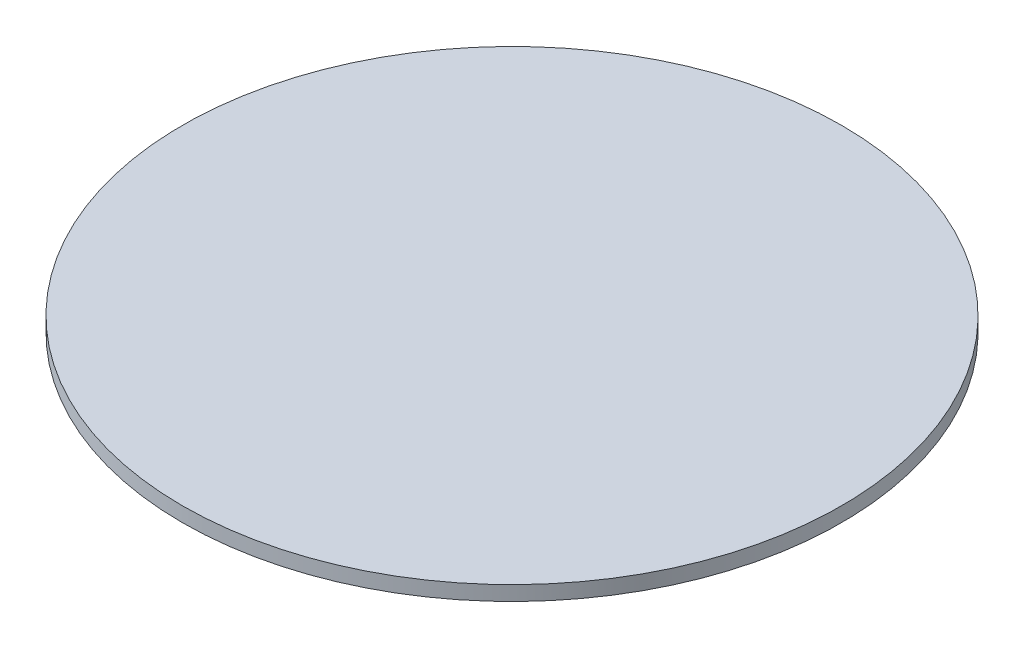
ISO-10303-21;
HEADER;
FILE_DESCRIPTION(('STEP AP214'),'2;1');
FILE_NAME('part.step','',(''),(''),'','','');
FILE_SCHEMA(('AUTOMOTIVE_DESIGN { 1 0 10303 214 1 1 1 1 }'));
ENDSEC;
DATA;
#1=APPLICATION_CONTEXT('core data for automotive mechanical design processes');
#2=APPLICATION_PROTOCOL_DEFINITION('international standard','automotive_design',2000,#1);
#3=PRODUCT_CONTEXT('',#1,'mechanical');
#4=PRODUCT('Part','Part','',(#3));
#5=PRODUCT_RELATED_PRODUCT_CATEGORY('part','',(#4));
#6=PRODUCT_DEFINITION_FORMATION('','',#4);
#7=PRODUCT_DEFINITION_CONTEXT('part definition',#1,'design');
#8=PRODUCT_DEFINITION('design','',#6,#7);
#9=PRODUCT_DEFINITION_SHAPE('','',#8);
#10=(LENGTH_UNIT() NAMED_UNIT(*) SI_UNIT(.MILLI.,.METRE.));
#11=(NAMED_UNIT(*) PLANE_ANGLE_UNIT() SI_UNIT($,.RADIAN.));
#12=(NAMED_UNIT(*) SI_UNIT($,.STERADIAN.) SOLID_ANGLE_UNIT());
#13=UNCERTAINTY_MEASURE_WITH_UNIT(LENGTH_MEASURE(1.E-05),#10,'distance_accuracy_value','');
#14=(GEOMETRIC_REPRESENTATION_CONTEXT(3) GLOBAL_UNCERTAINTY_ASSIGNED_CONTEXT((#13)) GLOBAL_UNIT_ASSIGNED_CONTEXT((#10,
#11,#12)) REPRESENTATION_CONTEXT('',''));
#15=CARTESIAN_POINT('',(0.,0.,0.));
#16=DIRECTION('',(0.,0.,1.));
#17=DIRECTION('',(1.,0.,0.));
#18=AXIS2_PLACEMENT_3D('',#15,#16,#17);
#19=CARTESIAN_POINT('',(0.,2.,0.));
#20=DIRECTION('',(0.,-1.,0.));
#21=DIRECTION('',(0.,0.,-1.));
#22=AXIS2_PLACEMENT_3D('',#19,#20,#21);
#23=CYLINDRICAL_SURFACE('',#22,45.);
#24=CARTESIAN_POINT('',(0.,2.,0.));
#25=DIRECTION('',(0.,1.,0.));
#26=DIRECTION('',(0.,0.,1.));
#27=AXIS2_PLACEMENT_3D('',#24,#25,#26);
#28=CIRCLE('',#27,45.);
#29=CARTESIAN_POINT('',(0.,2.,45.));
#30=VERTEX_POINT('',#29);
#31=EDGE_CURVE('E10',#30,#30,#28,.T.);
#32=ORIENTED_EDGE('',*,*,#31,.F.);
#33=EDGE_LOOP('',(#32));
#34=FACE_BOUND('',#33,.T.);
#35=CARTESIAN_POINT('',(0.,0.,0.));
#36=DIRECTION('',(0.,1.,0.));
#37=DIRECTION('',(0.,0.,1.));
#38=AXIS2_PLACEMENT_3D('',#35,#36,#37);
#39=CIRCLE('',#38,45.);
#40=CARTESIAN_POINT('',(0.,0.,45.));
#41=VERTEX_POINT('',#40);
#42=EDGE_CURVE('E41',#41,#41,#39,.T.);
#43=ORIENTED_EDGE('',*,*,#42,.T.);
#44=EDGE_LOOP('',(#43));
#45=FACE_BOUND('',#44,.T.);
#46=ADVANCED_FACE('F38',(#34,#45),#23,.T.);
#47=CARTESIAN_POINT('',(0.,2.,0.));
#48=DIRECTION('',(0.,1.,0.));
#49=DIRECTION('',(0.,0.,1.));
#50=AXIS2_PLACEMENT_3D('',#47,#48,#49);
#51=PLANE('',#50);
#52=ORIENTED_EDGE('',*,*,#31,.T.);
#53=EDGE_LOOP('',(#52));
#54=FACE_BOUND('',#53,.T.);
#55=ADVANCED_FACE('F53',(#54),#51,.T.);
#56=CARTESIAN_POINT('',(0.,0.,0.));
#57=DIRECTION('',(0.,1.,0.));
#58=DIRECTION('',(0.,0.,1.));
#59=AXIS2_PLACEMENT_3D('',#56,#57,#58);
#60=PLANE('',#59);
#61=ORIENTED_EDGE('',*,*,#42,.F.);
#62=EDGE_LOOP('',(#61));
#63=FACE_BOUND('',#62,.T.);
#64=ADVANCED_FACE('F51',(#63),#60,.F.);
#65=CLOSED_SHELL('',(#46,#55,#64));
#66=MANIFOLD_SOLID_BREP('B2',#65);
#67=ADVANCED_BREP_SHAPE_REPRESENTATION('',(#18,#66),#14);
#68=SHAPE_DEFINITION_REPRESENTATION(#9,#67);
ENDSEC;
END-ISO-10303-21;
